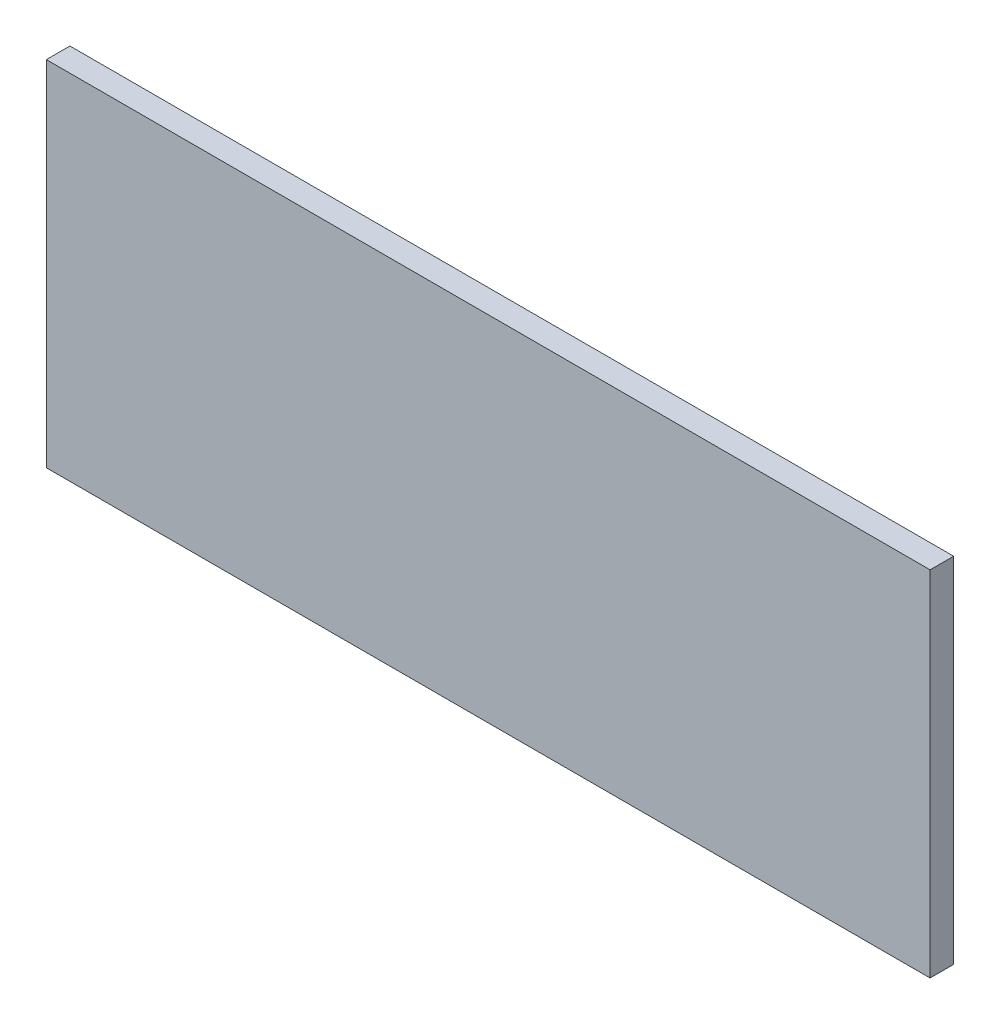
ISO-10303-21;
HEADER;
FILE_DESCRIPTION(('STEP AP214'),'2;1');
FILE_NAME('part.step','',(''),(''),'','','');
FILE_SCHEMA(('AUTOMOTIVE_DESIGN { 1 0 10303 214 1 1 1 1 }'));
ENDSEC;
DATA;
#1=APPLICATION_CONTEXT('core data for automotive mechanical design processes');
#2=APPLICATION_PROTOCOL_DEFINITION('international standard','automotive_design',2000,#1);
#3=PRODUCT_CONTEXT('',#1,'mechanical');
#4=PRODUCT('Part','Part','',(#3));
#5=PRODUCT_RELATED_PRODUCT_CATEGORY('part','',(#4));
#6=PRODUCT_DEFINITION_FORMATION('','',#4);
#7=PRODUCT_DEFINITION_CONTEXT('part definition',#1,'design');
#8=PRODUCT_DEFINITION('design','',#6,#7);
#9=PRODUCT_DEFINITION_SHAPE('','',#8);
#10=(LENGTH_UNIT() NAMED_UNIT(*) SI_UNIT(.MILLI.,.METRE.));
#11=(NAMED_UNIT(*) PLANE_ANGLE_UNIT() SI_UNIT($,.RADIAN.));
#12=(NAMED_UNIT(*) SI_UNIT($,.STERADIAN.) SOLID_ANGLE_UNIT());
#13=UNCERTAINTY_MEASURE_WITH_UNIT(LENGTH_MEASURE(1.E-05),#10,'distance_accuracy_value','');
#14=(GEOMETRIC_REPRESENTATION_CONTEXT(3) GLOBAL_UNCERTAINTY_ASSIGNED_CONTEXT((#13)) GLOBAL_UNIT_ASSIGNED_CONTEXT((#10,
#11,#12)) REPRESENTATION_CONTEXT('',''));
#15=CARTESIAN_POINT('',(0.,0.,0.));
#16=DIRECTION('',(0.,0.,1.));
#17=DIRECTION('',(1.,0.,0.));
#18=AXIS2_PLACEMENT_3D('',#15,#16,#17);
#19=CARTESIAN_POINT('',(75.,-30.,-2.));
#20=DIRECTION('',(0.,0.,1.));
#21=DIRECTION('',(1.,0.,0.));
#22=AXIS2_PLACEMENT_3D('',#19,#20,#21);
#23=PLANE('',#22);
#24=DIRECTION('',(0.,1.,0.));
#25=VECTOR('',#24,1.);
#26=CARTESIAN_POINT('',(-75.,-30.,-2.));
#27=LINE('',#26,#25);
#28=CARTESIAN_POINT('',(-75.,-30.,-2.));
#29=VERTEX_POINT('',#28);
#30=CARTESIAN_POINT('',(-75.,30.,-2.));
#31=VERTEX_POINT('',#30);
#32=EDGE_CURVE('E102',#29,#31,#27,.T.);
#33=ORIENTED_EDGE('',*,*,#32,.T.);
#34=DIRECTION('',(-1.,0.,0.));
#35=VECTOR('',#34,1.);
#36=CARTESIAN_POINT('',(75.,30.,-2.));
#37=LINE('',#36,#35);
#38=CARTESIAN_POINT('',(75.,30.,-2.));
#39=VERTEX_POINT('',#38);
#40=EDGE_CURVE('E11',#39,#31,#37,.T.);
#41=ORIENTED_EDGE('',*,*,#40,.F.);
#42=DIRECTION('',(0.,1.,0.));
#43=VECTOR('',#42,1.);
#44=CARTESIAN_POINT('',(75.,-30.,-2.));
#45=LINE('',#44,#43);
#46=CARTESIAN_POINT('',(75.,-30.,-2.));
#47=VERTEX_POINT('',#46);
#48=EDGE_CURVE('E90',#47,#39,#45,.T.);
#49=ORIENTED_EDGE('',*,*,#48,.F.);
#50=DIRECTION('',(-1.,0.,0.));
#51=VECTOR('',#50,1.);
#52=CARTESIAN_POINT('',(75.,-30.,-2.));
#53=LINE('',#52,#51);
#54=EDGE_CURVE('E98',#47,#29,#53,.T.);
#55=ORIENTED_EDGE('',*,*,#54,.T.);
#56=EDGE_LOOP('',(#33,#41,#49,#55));
#57=FACE_BOUND('',#56,.T.);
#58=ADVANCED_FACE('F37',(#57),#23,.F.);
#59=CARTESIAN_POINT('',(75.,30.,2.));
#60=DIRECTION('',(0.,-1.,0.));
#61=DIRECTION('',(0.,0.,-1.));
#62=AXIS2_PLACEMENT_3D('',#59,#60,#61);
#63=PLANE('',#62);
#64=DIRECTION('',(0.,0.,1.));
#65=VECTOR('',#64,1.);
#66=CARTESIAN_POINT('',(-75.,30.,2.));
#67=LINE('',#66,#65);
#68=CARTESIAN_POINT('',(-75.,30.,2.));
#69=VERTEX_POINT('',#68);
#70=EDGE_CURVE('E94',#31,#69,#67,.T.);
#71=ORIENTED_EDGE('',*,*,#70,.T.);
#72=DIRECTION('',(-1.,0.,0.));
#73=VECTOR('',#72,1.);
#74=CARTESIAN_POINT('',(75.,30.,2.));
#75=LINE('',#74,#73);
#76=CARTESIAN_POINT('',(75.,30.,2.));
#77=VERTEX_POINT('',#76);
#78=EDGE_CURVE('E45',#77,#69,#75,.T.);
#79=ORIENTED_EDGE('',*,*,#78,.F.);
#80=DIRECTION('',(0.,0.,1.));
#81=VECTOR('',#80,1.);
#82=CARTESIAN_POINT('',(75.,30.,2.));
#83=LINE('',#82,#81);
#84=EDGE_CURVE('E85',#39,#77,#83,.T.);
#85=ORIENTED_EDGE('',*,*,#84,.F.);
#86=ORIENTED_EDGE('',*,*,#40,.T.);
#87=EDGE_LOOP('',(#71,#79,#85,#86));
#88=FACE_BOUND('',#87,.T.);
#89=ADVANCED_FACE('F93',(#88),#63,.F.);
#90=CARTESIAN_POINT('',(75.,-30.,2.));
#91=DIRECTION('',(0.,0.,-1.));
#92=DIRECTION('',(-1.,0.,0.));
#93=AXIS2_PLACEMENT_3D('',#90,#91,#92);
#94=PLANE('',#93);
#95=DIRECTION('',(0.,-1.,0.));
#96=VECTOR('',#95,1.);
#97=CARTESIAN_POINT('',(-75.,-30.,2.));
#98=LINE('',#97,#96);
#99=CARTESIAN_POINT('',(-75.,-30.,2.));
#100=VERTEX_POINT('',#99);
#101=EDGE_CURVE('E72',#69,#100,#98,.T.);
#102=ORIENTED_EDGE('',*,*,#101,.T.);
#103=DIRECTION('',(-1.,0.,0.));
#104=VECTOR('',#103,1.);
#105=CARTESIAN_POINT('',(75.,-30.,2.));
#106=LINE('',#105,#104);
#107=CARTESIAN_POINT('',(75.,-30.,2.));
#108=VERTEX_POINT('',#107);
#109=EDGE_CURVE('E95',#108,#100,#106,.T.);
#110=ORIENTED_EDGE('',*,*,#109,.F.);
#111=DIRECTION('',(0.,-1.,0.));
#112=VECTOR('',#111,1.);
#113=CARTESIAN_POINT('',(75.,-30.,2.));
#114=LINE('',#113,#112);
#115=EDGE_CURVE('E88',#77,#108,#114,.T.);
#116=ORIENTED_EDGE('',*,*,#115,.F.);
#117=ORIENTED_EDGE('',*,*,#78,.T.);
#118=EDGE_LOOP('',(#102,#110,#116,#117));
#119=FACE_BOUND('',#118,.T.);
#120=ADVANCED_FACE('F96',(#119),#94,.F.);
#121=CARTESIAN_POINT('',(75.,-30.,2.));
#122=DIRECTION('',(0.,1.,0.));
#123=DIRECTION('',(0.,0.,1.));
#124=AXIS2_PLACEMENT_3D('',#121,#122,#123);
#125=PLANE('',#124);
#126=DIRECTION('',(0.,0.,-1.));
#127=VECTOR('',#126,1.);
#128=CARTESIAN_POINT('',(-75.,-30.,2.));
#129=LINE('',#128,#127);
#130=EDGE_CURVE('E78',#100,#29,#129,.T.);
#131=ORIENTED_EDGE('',*,*,#130,.T.);
#132=ORIENTED_EDGE('',*,*,#54,.F.);
#133=DIRECTION('',(0.,0.,-1.));
#134=VECTOR('',#133,1.);
#135=CARTESIAN_POINT('',(75.,-30.,2.));
#136=LINE('',#135,#134);
#137=EDGE_CURVE('E53',#108,#47,#136,.T.);
#138=ORIENTED_EDGE('',*,*,#137,.F.);
#139=ORIENTED_EDGE('',*,*,#109,.T.);
#140=EDGE_LOOP('',(#131,#132,#138,#139));
#141=FACE_BOUND('',#140,.T.);
#142=ADVANCED_FACE('F114',(#141),#125,.F.);
#143=CARTESIAN_POINT('',(75.,0.,0.));
#144=DIRECTION('',(-1.,0.,0.));
#145=DIRECTION('',(0.,0.,1.));
#146=AXIS2_PLACEMENT_3D('',#143,#144,#145);
#147=PLANE('',#146);
#148=ORIENTED_EDGE('',*,*,#48,.T.);
#149=ORIENTED_EDGE('',*,*,#84,.T.);
#150=ORIENTED_EDGE('',*,*,#115,.T.);
#151=ORIENTED_EDGE('',*,*,#137,.T.);
#152=EDGE_LOOP('',(#148,#149,#150,#151));
#153=FACE_BOUND('',#152,.T.);
#154=ADVANCED_FACE('F86',(#153),#147,.F.);
#155=CARTESIAN_POINT('',(-75.,0.,0.));
#156=DIRECTION('',(-1.,0.,0.));
#157=DIRECTION('',(0.,0.,1.));
#158=AXIS2_PLACEMENT_3D('',#155,#156,#157);
#159=PLANE('',#158);
#160=ORIENTED_EDGE('',*,*,#32,.F.);
#161=ORIENTED_EDGE('',*,*,#130,.F.);
#162=ORIENTED_EDGE('',*,*,#101,.F.);
#163=ORIENTED_EDGE('',*,*,#70,.F.);
#164=EDGE_LOOP('',(#160,#161,#162,#163));
#165=FACE_BOUND('',#164,.T.);
#166=ADVANCED_FACE('F117',(#165),#159,.T.);
#167=CLOSED_SHELL('',(#58,#89,#120,#142,#154,#166));
#168=MANIFOLD_SOLID_BREP('B2',#167);
#169=ADVANCED_BREP_SHAPE_REPRESENTATION('',(#18,#168),#14);
#170=SHAPE_DEFINITION_REPRESENTATION(#9,#169);
ENDSEC;
END-ISO-10303-21;
